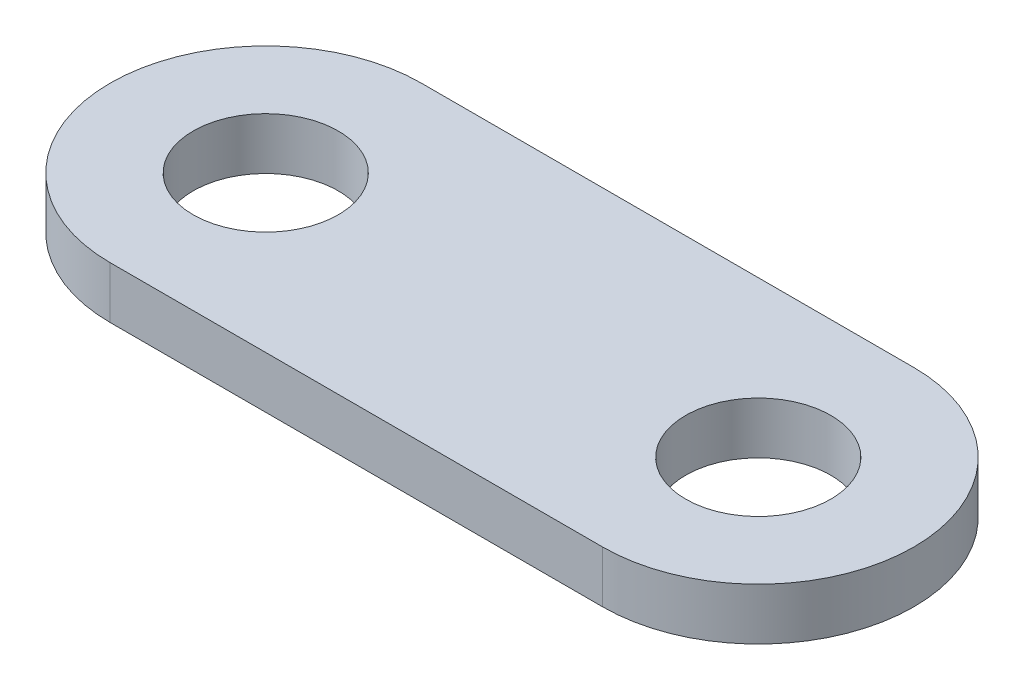
ISO-10303-21;
HEADER;
FILE_DESCRIPTION(('STEP AP214'),'2;1');
FILE_NAME('part.step','',(''),(''),'','','');
FILE_SCHEMA(('AUTOMOTIVE_DESIGN { 1 0 10303 214 1 1 1 1 }'));
ENDSEC;
DATA;
#1=APPLICATION_CONTEXT('core data for automotive mechanical design processes');
#2=APPLICATION_PROTOCOL_DEFINITION('international standard','automotive_design',2000,#1);
#3=PRODUCT_CONTEXT('',#1,'mechanical');
#4=PRODUCT('Part','Part','',(#3));
#5=PRODUCT_RELATED_PRODUCT_CATEGORY('part','',(#4));
#6=PRODUCT_DEFINITION_FORMATION('','',#4);
#7=PRODUCT_DEFINITION_CONTEXT('part definition',#1,'design');
#8=PRODUCT_DEFINITION('design','',#6,#7);
#9=PRODUCT_DEFINITION_SHAPE('','',#8);
#10=(LENGTH_UNIT() NAMED_UNIT(*) SI_UNIT(.MILLI.,.METRE.));
#11=(NAMED_UNIT(*) PLANE_ANGLE_UNIT() SI_UNIT($,.RADIAN.));
#12=(NAMED_UNIT(*) SI_UNIT($,.STERADIAN.) SOLID_ANGLE_UNIT());
#13=UNCERTAINTY_MEASURE_WITH_UNIT(LENGTH_MEASURE(1.E-05),#10,'distance_accuracy_value','');
#14=(GEOMETRIC_REPRESENTATION_CONTEXT(3) GLOBAL_UNCERTAINTY_ASSIGNED_CONTEXT((#13)) GLOBAL_UNIT_ASSIGNED_CONTEXT((#10,
#11,#12)) REPRESENTATION_CONTEXT('',''));
#15=CARTESIAN_POINT('',(0.,0.,0.));
#16=DIRECTION('',(0.,0.,1.));
#17=DIRECTION('',(1.,0.,0.));
#18=AXIS2_PLACEMENT_3D('',#15,#16,#17);
#19=CARTESIAN_POINT('',(-23.75,5.,0.));
#20=DIRECTION('',(0.,1.,0.));
#21=DIRECTION('',(0.,0.,1.));
#22=AXIS2_PLACEMENT_3D('',#19,#20,#21);
#23=PLANE('',#22);
#24=CARTESIAN_POINT('',(-23.75,5.,0.));
#25=DIRECTION('',(0.,1.,0.));
#26=DIRECTION('',(0.,0.,1.));
#27=AXIS2_PLACEMENT_3D('',#24,#25,#26);
#28=CIRCLE('',#27,7.);
#29=CARTESIAN_POINT('',(-23.75,5.,7.));
#30=VERTEX_POINT('',#29);
#31=EDGE_CURVE('E101',#30,#30,#28,.T.);
#32=ORIENTED_EDGE('',*,*,#31,.F.);
#33=EDGE_LOOP('',(#32));
#34=FACE_BOUND('',#33,.T.);
#35=CARTESIAN_POINT('',(-23.75,5.,0.));
#36=DIRECTION('',(0.,1.,0.));
#37=DIRECTION('',(0.,0.,1.));
#38=AXIS2_PLACEMENT_3D('',#35,#36,#37);
#39=CIRCLE('',#38,15.);
#40=CARTESIAN_POINT('',(-23.75,5.,-15.));
#41=VERTEX_POINT('',#40);
#42=CARTESIAN_POINT('',(-23.75,5.,15.));
#43=VERTEX_POINT('',#42);
#44=EDGE_CURVE('E86',#41,#43,#39,.T.);
#45=ORIENTED_EDGE('',*,*,#44,.T.);
#46=DIRECTION('',(1.,0.,0.));
#47=VECTOR('',#46,1.);
#48=CARTESIAN_POINT('',(-23.75,5.,15.));
#49=LINE('',#48,#47);
#50=CARTESIAN_POINT('',(23.75,5.,15.));
#51=VERTEX_POINT('',#50);
#52=EDGE_CURVE('E81',#43,#51,#49,.T.);
#53=ORIENTED_EDGE('',*,*,#52,.T.);
#54=CARTESIAN_POINT('',(23.75,5.,0.));
#55=DIRECTION('',(0.,1.,0.));
#56=DIRECTION('',(0.,0.,1.));
#57=AXIS2_PLACEMENT_3D('',#54,#55,#56);
#58=CIRCLE('',#57,15.);
#59=CARTESIAN_POINT('',(23.75,5.,-15.));
#60=VERTEX_POINT('',#59);
#61=EDGE_CURVE('E84',#51,#60,#58,.T.);
#62=ORIENTED_EDGE('',*,*,#61,.T.);
#63=DIRECTION('',(-1.,0.,0.));
#64=VECTOR('',#63,1.);
#65=CARTESIAN_POINT('',(-23.75,5.,-15.));
#66=LINE('',#65,#64);
#67=EDGE_CURVE('E51',#60,#41,#66,.T.);
#68=ORIENTED_EDGE('',*,*,#67,.T.);
#69=EDGE_LOOP('',(#45,#53,#62,#68));
#70=FACE_BOUND('',#69,.T.);
#71=CARTESIAN_POINT('',(23.75,5.,0.));
#72=DIRECTION('',(0.,1.,0.));
#73=DIRECTION('',(0.,0.,1.));
#74=AXIS2_PLACEMENT_3D('',#71,#72,#73);
#75=CIRCLE('',#74,7.);
#76=CARTESIAN_POINT('',(23.75,5.,7.));
#77=VERTEX_POINT('',#76);
#78=EDGE_CURVE('E116',#77,#77,#75,.T.);
#79=ORIENTED_EDGE('',*,*,#78,.F.);
#80=EDGE_LOOP('',(#79));
#81=FACE_BOUND('',#80,.T.);
#82=ADVANCED_FACE('F34',(#34,#70,#81),#23,.T.);
#83=CARTESIAN_POINT('',(-23.75,0.,0.));
#84=DIRECTION('',(0.,1.,0.));
#85=DIRECTION('',(0.,0.,1.));
#86=AXIS2_PLACEMENT_3D('',#83,#84,#85);
#87=PLANE('',#86);
#88=CARTESIAN_POINT('',(-23.75,0.,0.));
#89=DIRECTION('',(0.,1.,0.));
#90=DIRECTION('',(0.,0.,1.));
#91=AXIS2_PLACEMENT_3D('',#88,#89,#90);
#92=CIRCLE('',#91,15.);
#93=CARTESIAN_POINT('',(-23.75,0.,-15.));
#94=VERTEX_POINT('',#93);
#95=CARTESIAN_POINT('',(-23.75,0.,15.));
#96=VERTEX_POINT('',#95);
#97=EDGE_CURVE('E98',#94,#96,#92,.T.);
#98=ORIENTED_EDGE('',*,*,#97,.F.);
#99=DIRECTION('',(-1.,0.,0.));
#100=VECTOR('',#99,1.);
#101=CARTESIAN_POINT('',(-23.75,0.,-15.));
#102=LINE('',#101,#100);
#103=CARTESIAN_POINT('',(23.75,0.,-15.));
#104=VERTEX_POINT('',#103);
#105=EDGE_CURVE('E74',#104,#94,#102,.T.);
#106=ORIENTED_EDGE('',*,*,#105,.F.);
#107=CARTESIAN_POINT('',(23.75,0.,0.));
#108=DIRECTION('',(0.,1.,0.));
#109=DIRECTION('',(0.,0.,1.));
#110=AXIS2_PLACEMENT_3D('',#107,#108,#109);
#111=CIRCLE('',#110,15.);
#112=CARTESIAN_POINT('',(23.75,0.,15.));
#113=VERTEX_POINT('',#112);
#114=EDGE_CURVE('E68',#113,#104,#111,.T.);
#115=ORIENTED_EDGE('',*,*,#114,.F.);
#116=DIRECTION('',(1.,0.,0.));
#117=VECTOR('',#116,1.);
#118=CARTESIAN_POINT('',(-23.75,0.,15.));
#119=LINE('',#118,#117);
#120=EDGE_CURVE('E90',#96,#113,#119,.T.);
#121=ORIENTED_EDGE('',*,*,#120,.F.);
#122=EDGE_LOOP('',(#98,#106,#115,#121));
#123=FACE_BOUND('',#122,.T.);
#124=CARTESIAN_POINT('',(-23.75,0.,0.));
#125=DIRECTION('',(0.,1.,0.));
#126=DIRECTION('',(0.,0.,1.));
#127=AXIS2_PLACEMENT_3D('',#124,#125,#126);
#128=CIRCLE('',#127,7.);
#129=CARTESIAN_POINT('',(-23.75,0.,7.));
#130=VERTEX_POINT('',#129);
#131=EDGE_CURVE('E113',#130,#130,#128,.T.);
#132=ORIENTED_EDGE('',*,*,#131,.T.);
#133=EDGE_LOOP('',(#132));
#134=FACE_BOUND('',#133,.T.);
#135=CARTESIAN_POINT('',(23.75,0.,0.));
#136=DIRECTION('',(0.,1.,0.));
#137=DIRECTION('',(0.,0.,1.));
#138=AXIS2_PLACEMENT_3D('',#135,#136,#137);
#139=CIRCLE('',#138,7.);
#140=CARTESIAN_POINT('',(23.75,0.,7.));
#141=VERTEX_POINT('',#140);
#142=EDGE_CURVE('E119',#141,#141,#139,.T.);
#143=ORIENTED_EDGE('',*,*,#142,.T.);
#144=EDGE_LOOP('',(#143));
#145=FACE_BOUND('',#144,.T.);
#146=ADVANCED_FACE('F109',(#123,#134,#145),#87,.F.);
#147=CARTESIAN_POINT('',(-23.75,5.,0.));
#148=DIRECTION('',(0.,-1.,0.));
#149=DIRECTION('',(0.,0.,-1.));
#150=AXIS2_PLACEMENT_3D('',#147,#148,#149);
#151=CYLINDRICAL_SURFACE('',#150,15.);
#152=ORIENTED_EDGE('',*,*,#97,.T.);
#153=DIRECTION('',(0.,-1.,0.));
#154=VECTOR('',#153,1.);
#155=CARTESIAN_POINT('',(-23.75,5.,15.));
#156=LINE('',#155,#154);
#157=EDGE_CURVE('E11',#43,#96,#156,.T.);
#158=ORIENTED_EDGE('',*,*,#157,.F.);
#159=ORIENTED_EDGE('',*,*,#44,.F.);
#160=DIRECTION('',(0.,-1.,0.));
#161=VECTOR('',#160,1.);
#162=CARTESIAN_POINT('',(-23.75,5.,-15.));
#163=LINE('',#162,#161);
#164=EDGE_CURVE('E94',#41,#94,#163,.T.);
#165=ORIENTED_EDGE('',*,*,#164,.T.);
#166=EDGE_LOOP('',(#152,#158,#159,#165));
#167=FACE_BOUND('',#166,.T.);
#168=ADVANCED_FACE('F36',(#167),#151,.T.);
#169=CARTESIAN_POINT('',(-23.75,5.,15.));
#170=DIRECTION('',(0.,0.,-1.));
#171=DIRECTION('',(-1.,0.,0.));
#172=AXIS2_PLACEMENT_3D('',#169,#170,#171);
#173=PLANE('',#172);
#174=ORIENTED_EDGE('',*,*,#120,.T.);
#175=DIRECTION('',(0.,-1.,0.));
#176=VECTOR('',#175,1.);
#177=CARTESIAN_POINT('',(23.75,5.,15.));
#178=LINE('',#177,#176);
#179=EDGE_CURVE('E43',#51,#113,#178,.T.);
#180=ORIENTED_EDGE('',*,*,#179,.F.);
#181=ORIENTED_EDGE('',*,*,#52,.F.);
#182=ORIENTED_EDGE('',*,*,#157,.T.);
#183=EDGE_LOOP('',(#174,#180,#181,#182));
#184=FACE_BOUND('',#183,.T.);
#185=ADVANCED_FACE('F89',(#184),#173,.F.);
#186=CARTESIAN_POINT('',(23.75,5.,0.));
#187=DIRECTION('',(0.,-1.,0.));
#188=DIRECTION('',(0.,0.,-1.));
#189=AXIS2_PLACEMENT_3D('',#186,#187,#188);
#190=CYLINDRICAL_SURFACE('',#189,15.);
#191=ORIENTED_EDGE('',*,*,#114,.T.);
#192=DIRECTION('',(0.,-1.,0.));
#193=VECTOR('',#192,1.);
#194=CARTESIAN_POINT('',(23.75,5.,-15.));
#195=LINE('',#194,#193);
#196=EDGE_CURVE('E91',#60,#104,#195,.T.);
#197=ORIENTED_EDGE('',*,*,#196,.F.);
#198=ORIENTED_EDGE('',*,*,#61,.F.);
#199=ORIENTED_EDGE('',*,*,#179,.T.);
#200=EDGE_LOOP('',(#191,#197,#198,#199));
#201=FACE_BOUND('',#200,.T.);
#202=ADVANCED_FACE('F92',(#201),#190,.T.);
#203=CARTESIAN_POINT('',(-23.75,5.,-15.));
#204=DIRECTION('',(0.,0.,1.));
#205=DIRECTION('',(1.,0.,0.));
#206=AXIS2_PLACEMENT_3D('',#203,#204,#205);
#207=PLANE('',#206);
#208=ORIENTED_EDGE('',*,*,#105,.T.);
#209=ORIENTED_EDGE('',*,*,#164,.F.);
#210=ORIENTED_EDGE('',*,*,#67,.F.);
#211=ORIENTED_EDGE('',*,*,#196,.T.);
#212=EDGE_LOOP('',(#208,#209,#210,#211));
#213=FACE_BOUND('',#212,.T.);
#214=ADVANCED_FACE('F106',(#213),#207,.F.);
#215=CARTESIAN_POINT('',(-23.75,5.,0.));
#216=DIRECTION('',(0.,-1.,0.));
#217=DIRECTION('',(0.,0.,-1.));
#218=AXIS2_PLACEMENT_3D('',#215,#216,#217);
#219=CYLINDRICAL_SURFACE('',#218,7.);
#220=ORIENTED_EDGE('',*,*,#31,.T.);
#221=EDGE_LOOP('',(#220));
#222=FACE_BOUND('',#221,.T.);
#223=ORIENTED_EDGE('',*,*,#131,.F.);
#224=EDGE_LOOP('',(#223));
#225=FACE_BOUND('',#224,.T.);
#226=ADVANCED_FACE('F136',(#222,#225),#219,.F.);
#227=CARTESIAN_POINT('',(23.75,5.,0.));
#228=DIRECTION('',(0.,-1.,0.));
#229=DIRECTION('',(0.,0.,-1.));
#230=AXIS2_PLACEMENT_3D('',#227,#228,#229);
#231=CYLINDRICAL_SURFACE('',#230,7.);
#232=ORIENTED_EDGE('',*,*,#78,.T.);
#233=EDGE_LOOP('',(#232));
#234=FACE_BOUND('',#233,.T.);
#235=ORIENTED_EDGE('',*,*,#142,.F.);
#236=EDGE_LOOP('',(#235));
#237=FACE_BOUND('',#236,.T.);
#238=ADVANCED_FACE('F125',(#234,#237),#231,.F.);
#239=CLOSED_SHELL('',(#82,#146,#168,#185,#202,#214,#226,#238));
#240=MANIFOLD_SOLID_BREP('B2',#239);
#241=ADVANCED_BREP_SHAPE_REPRESENTATION('',(#18,#240),#14);
#242=SHAPE_DEFINITION_REPRESENTATION(#9,#241);
ENDSEC;
END-ISO-10303-21;
